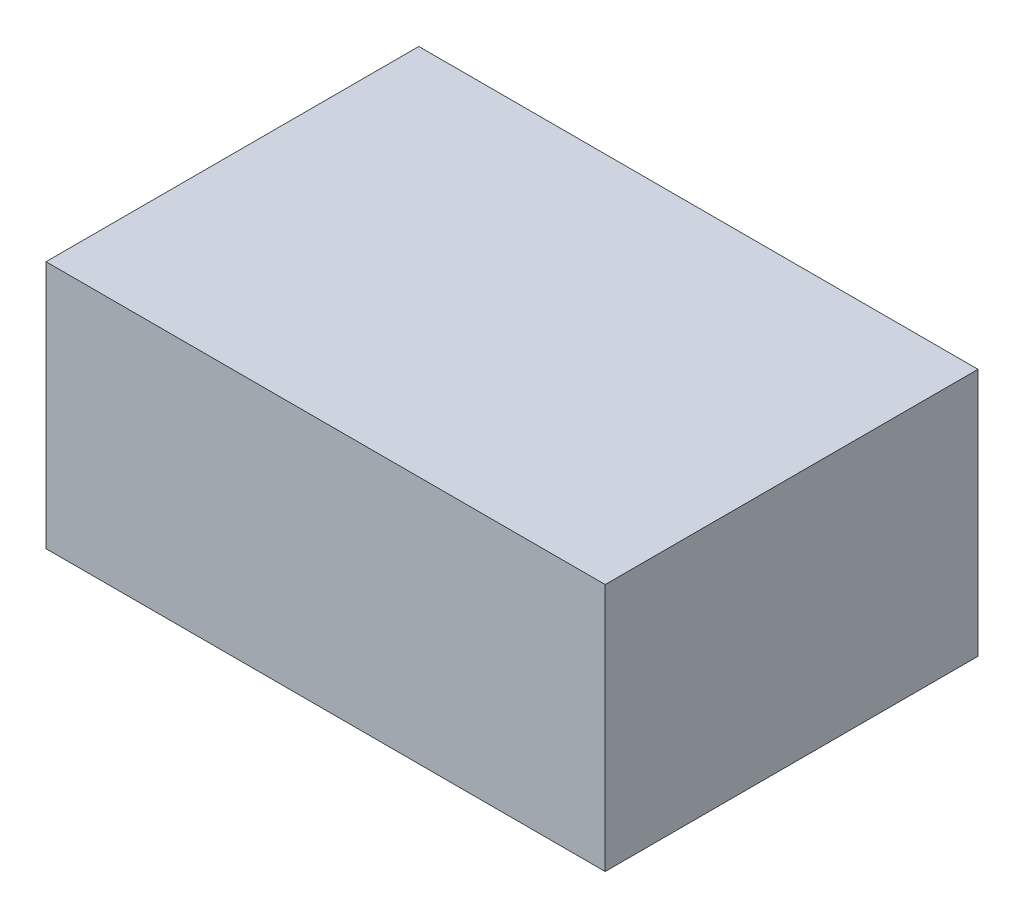
ISO-10303-21;
HEADER;
FILE_DESCRIPTION(('STEP AP214'),'2;1');
FILE_NAME('part.step','',(''),(''),'','','');
FILE_SCHEMA(('AUTOMOTIVE_DESIGN { 1 0 10303 214 1 1 1 1 }'));
ENDSEC;
DATA;
#1=APPLICATION_CONTEXT('core data for automotive mechanical design processes');
#2=APPLICATION_PROTOCOL_DEFINITION('international standard','automotive_design',2000,#1);
#3=PRODUCT_CONTEXT('',#1,'mechanical');
#4=PRODUCT('Part','Part','',(#3));
#5=PRODUCT_RELATED_PRODUCT_CATEGORY('part','',(#4));
#6=PRODUCT_DEFINITION_FORMATION('','',#4);
#7=PRODUCT_DEFINITION_CONTEXT('part definition',#1,'design');
#8=PRODUCT_DEFINITION('design','',#6,#7);
#9=PRODUCT_DEFINITION_SHAPE('','',#8);
#10=(LENGTH_UNIT() NAMED_UNIT(*) SI_UNIT(.MILLI.,.METRE.));
#11=(NAMED_UNIT(*) PLANE_ANGLE_UNIT() SI_UNIT($,.RADIAN.));
#12=(NAMED_UNIT(*) SI_UNIT($,.STERADIAN.) SOLID_ANGLE_UNIT());
#13=UNCERTAINTY_MEASURE_WITH_UNIT(LENGTH_MEASURE(1.E-05),#10,'distance_accuracy_value','');
#14=(GEOMETRIC_REPRESENTATION_CONTEXT(3) GLOBAL_UNCERTAINTY_ASSIGNED_CONTEXT((#13)) GLOBAL_UNIT_ASSIGNED_CONTEXT((#10,
#11,#12)) REPRESENTATION_CONTEXT('',''));
#15=CARTESIAN_POINT('',(0.,0.,0.));
#16=DIRECTION('',(0.,0.,1.));
#17=DIRECTION('',(1.,0.,0.));
#18=AXIS2_PLACEMENT_3D('',#15,#16,#17);
#19=CARTESIAN_POINT('',(-22.1391316236341,38.1,23.3730463066267));
#20=DIRECTION('',(1.,0.,0.));
#21=DIRECTION('',(0.,0.,-1.));
#22=AXIS2_PLACEMENT_3D('',#19,#20,#21);
#23=PLANE('',#22);
#24=DIRECTION('',(0.,0.,1.));
#25=VECTOR('',#24,1.);
#26=CARTESIAN_POINT('',(-22.1391316236341,0.,23.3730463066267));
#27=LINE('',#26,#25);
#28=CARTESIAN_POINT('',(-22.1391316236341,0.,-33.7769536933733));
#29=VERTEX_POINT('',#28);
#30=CARTESIAN_POINT('',(-22.1391316236341,0.,23.3730463066267));
#31=VERTEX_POINT('',#30);
#32=EDGE_CURVE('E96',#29,#31,#27,.T.);
#33=ORIENTED_EDGE('',*,*,#32,.T.);
#34=DIRECTION('',(0.,-1.,0.));
#35=VECTOR('',#34,1.);
#36=CARTESIAN_POINT('',(-22.1391316236341,38.1,23.3730463066267));
#37=LINE('',#36,#35);
#38=CARTESIAN_POINT('',(-22.1391316236341,38.1,23.3730463066267));
#39=VERTEX_POINT('',#38);
#40=EDGE_CURVE('E11',#39,#31,#37,.T.);
#41=ORIENTED_EDGE('',*,*,#40,.F.);
#42=DIRECTION('',(0.,0.,1.));
#43=VECTOR('',#42,1.);
#44=CARTESIAN_POINT('',(-22.1391316236341,38.1,23.3730463066267));
#45=LINE('',#44,#43);
#46=CARTESIAN_POINT('',(-22.1391316236341,38.1,-33.7769536933733));
#47=VERTEX_POINT('',#46);
#48=EDGE_CURVE('E84',#47,#39,#45,.T.);
#49=ORIENTED_EDGE('',*,*,#48,.F.);
#50=DIRECTION('',(0.,-1.,0.));
#51=VECTOR('',#50,1.);
#52=CARTESIAN_POINT('',(-22.1391316236341,38.1,-33.7769536933733));
#53=LINE('',#52,#51);
#54=EDGE_CURVE('E92',#47,#29,#53,.T.);
#55=ORIENTED_EDGE('',*,*,#54,.T.);
#56=EDGE_LOOP('',(#33,#41,#49,#55));
#57=FACE_BOUND('',#56,.T.);
#58=ADVANCED_FACE('F33',(#57),#23,.F.);
#59=CARTESIAN_POINT('',(63.5858683763659,38.1,23.3730463066267));
#60=DIRECTION('',(0.,0.,-1.));
#61=DIRECTION('',(-1.,0.,0.));
#62=AXIS2_PLACEMENT_3D('',#59,#60,#61);
#63=PLANE('',#62);
#64=DIRECTION('',(1.,0.,0.));
#65=VECTOR('',#64,1.);
#66=CARTESIAN_POINT('',(63.5858683763659,0.,23.3730463066267));
#67=LINE('',#66,#65);
#68=CARTESIAN_POINT('',(63.5858683763659,0.,23.3730463066267));
#69=VERTEX_POINT('',#68);
#70=EDGE_CURVE('E88',#31,#69,#67,.T.);
#71=ORIENTED_EDGE('',*,*,#70,.T.);
#72=DIRECTION('',(0.,-1.,0.));
#73=VECTOR('',#72,1.);
#74=CARTESIAN_POINT('',(63.5858683763659,38.1,23.3730463066267));
#75=LINE('',#74,#73);
#76=CARTESIAN_POINT('',(63.5858683763659,38.1,23.3730463066267));
#77=VERTEX_POINT('',#76);
#78=EDGE_CURVE('E41',#77,#69,#75,.T.);
#79=ORIENTED_EDGE('',*,*,#78,.F.);
#80=DIRECTION('',(1.,0.,0.));
#81=VECTOR('',#80,1.);
#82=CARTESIAN_POINT('',(63.5858683763659,38.1,23.3730463066267));
#83=LINE('',#82,#81);
#84=EDGE_CURVE('E79',#39,#77,#83,.T.);
#85=ORIENTED_EDGE('',*,*,#84,.F.);
#86=ORIENTED_EDGE('',*,*,#40,.T.);
#87=EDGE_LOOP('',(#71,#79,#85,#86));
#88=FACE_BOUND('',#87,.T.);
#89=ADVANCED_FACE('F87',(#88),#63,.F.);
#90=CARTESIAN_POINT('',(63.5858683763659,38.1,-33.7769536933733));
#91=DIRECTION('',(-1.,0.,0.));
#92=DIRECTION('',(0.,0.,1.));
#93=AXIS2_PLACEMENT_3D('',#90,#91,#92);
#94=PLANE('',#93);
#95=DIRECTION('',(0.,0.,-1.));
#96=VECTOR('',#95,1.);
#97=CARTESIAN_POINT('',(63.5858683763659,0.,-33.7769536933733));
#98=LINE('',#97,#96);
#99=CARTESIAN_POINT('',(63.5858683763659,0.,-33.7769536933733));
#100=VERTEX_POINT('',#99);
#101=EDGE_CURVE('E66',#69,#100,#98,.T.);
#102=ORIENTED_EDGE('',*,*,#101,.T.);
#103=DIRECTION('',(0.,-1.,0.));
#104=VECTOR('',#103,1.);
#105=CARTESIAN_POINT('',(63.5858683763659,38.1,-33.7769536933733));
#106=LINE('',#105,#104);
#107=CARTESIAN_POINT('',(63.5858683763659,38.1,-33.7769536933733));
#108=VERTEX_POINT('',#107);
#109=EDGE_CURVE('E89',#108,#100,#106,.T.);
#110=ORIENTED_EDGE('',*,*,#109,.F.);
#111=DIRECTION('',(0.,0.,-1.));
#112=VECTOR('',#111,1.);
#113=CARTESIAN_POINT('',(63.5858683763659,38.1,-33.7769536933733));
#114=LINE('',#113,#112);
#115=EDGE_CURVE('E82',#77,#108,#114,.T.);
#116=ORIENTED_EDGE('',*,*,#115,.F.);
#117=ORIENTED_EDGE('',*,*,#78,.T.);
#118=EDGE_LOOP('',(#102,#110,#116,#117));
#119=FACE_BOUND('',#118,.T.);
#120=ADVANCED_FACE('F90',(#119),#94,.F.);
#121=CARTESIAN_POINT('',(-22.1391316236341,38.1,-33.7769536933733));
#122=DIRECTION('',(0.,0.,1.));
#123=DIRECTION('',(1.,0.,0.));
#124=AXIS2_PLACEMENT_3D('',#121,#122,#123);
#125=PLANE('',#124);
#126=DIRECTION('',(-1.,0.,0.));
#127=VECTOR('',#126,1.);
#128=CARTESIAN_POINT('',(-22.1391316236341,0.,-33.7769536933733));
#129=LINE('',#128,#127);
#130=EDGE_CURVE('E72',#100,#29,#129,.T.);
#131=ORIENTED_EDGE('',*,*,#130,.T.);
#132=ORIENTED_EDGE('',*,*,#54,.F.);
#133=DIRECTION('',(-1.,0.,0.));
#134=VECTOR('',#133,1.);
#135=CARTESIAN_POINT('',(-22.1391316236341,38.1,-33.7769536933733));
#136=LINE('',#135,#134);
#137=EDGE_CURVE('E49',#108,#47,#136,.T.);
#138=ORIENTED_EDGE('',*,*,#137,.F.);
#139=ORIENTED_EDGE('',*,*,#109,.T.);
#140=EDGE_LOOP('',(#131,#132,#138,#139));
#141=FACE_BOUND('',#140,.T.);
#142=ADVANCED_FACE('F103',(#141),#125,.F.);
#143=CARTESIAN_POINT('',(0.,38.1,0.));
#144=DIRECTION('',(0.,-1.,0.));
#145=DIRECTION('',(0.,0.,-1.));
#146=AXIS2_PLACEMENT_3D('',#143,#144,#145);
#147=PLANE('',#146);
#148=ORIENTED_EDGE('',*,*,#48,.T.);
#149=ORIENTED_EDGE('',*,*,#84,.T.);
#150=ORIENTED_EDGE('',*,*,#115,.T.);
#151=ORIENTED_EDGE('',*,*,#137,.T.);
#152=EDGE_LOOP('',(#148,#149,#150,#151));
#153=FACE_BOUND('',#152,.T.);
#154=ADVANCED_FACE('F80',(#153),#147,.F.);
#155=CARTESIAN_POINT('',(0.,0.,0.));
#156=DIRECTION('',(0.,-1.,0.));
#157=DIRECTION('',(0.,0.,-1.));
#158=AXIS2_PLACEMENT_3D('',#155,#156,#157);
#159=PLANE('',#158);
#160=ORIENTED_EDGE('',*,*,#32,.F.);
#161=ORIENTED_EDGE('',*,*,#130,.F.);
#162=ORIENTED_EDGE('',*,*,#101,.F.);
#163=ORIENTED_EDGE('',*,*,#70,.F.);
#164=EDGE_LOOP('',(#160,#161,#162,#163));
#165=FACE_BOUND('',#164,.T.);
#166=ADVANCED_FACE('F106',(#165),#159,.T.);
#167=CLOSED_SHELL('',(#58,#89,#120,#142,#154,#166));
#168=MANIFOLD_SOLID_BREP('B2',#167);
#169=ADVANCED_BREP_SHAPE_REPRESENTATION('',(#18,#168),#14);
#170=SHAPE_DEFINITION_REPRESENTATION(#9,#169);
ENDSEC;
END-ISO-10303-21;
